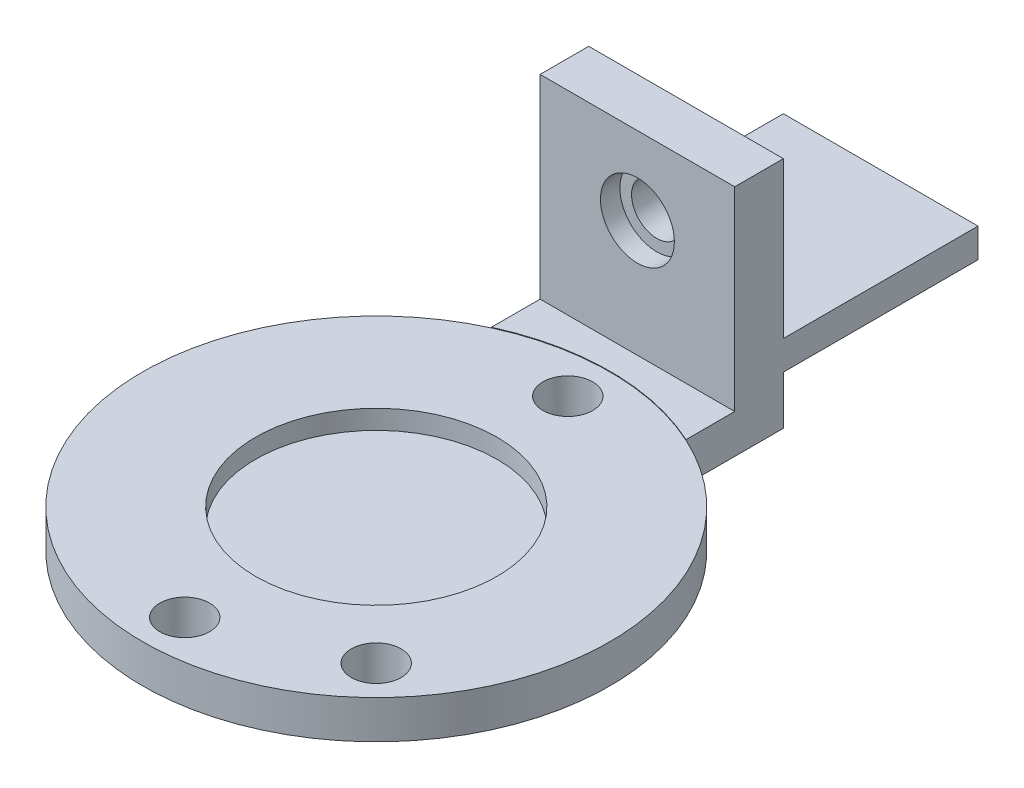
ISO-10303-21;
HEADER;
FILE_DESCRIPTION(('STEP AP214'),'2;1');
FILE_NAME('part.step','',(''),(''),'','','');
FILE_SCHEMA(('AUTOMOTIVE_DESIGN { 1 0 10303 214 1 1 1 1 }'));
ENDSEC;
DATA;
#1=APPLICATION_CONTEXT('core data for automotive mechanical design processes');
#2=APPLICATION_PROTOCOL_DEFINITION('international standard','automotive_design',2000,#1);
#3=PRODUCT_CONTEXT('',#1,'mechanical');
#4=PRODUCT('Part','Part','',(#3));
#5=PRODUCT_RELATED_PRODUCT_CATEGORY('part','',(#4));
#6=PRODUCT_DEFINITION_FORMATION('','',#4);
#7=PRODUCT_DEFINITION_CONTEXT('part definition',#1,'design');
#8=PRODUCT_DEFINITION('design','',#6,#7);
#9=PRODUCT_DEFINITION_SHAPE('','',#8);
#10=(LENGTH_UNIT() NAMED_UNIT(*) SI_UNIT(.MILLI.,.METRE.));
#11=(NAMED_UNIT(*) PLANE_ANGLE_UNIT() SI_UNIT($,.RADIAN.));
#12=(NAMED_UNIT(*) SI_UNIT($,.STERADIAN.) SOLID_ANGLE_UNIT());
#13=UNCERTAINTY_MEASURE_WITH_UNIT(LENGTH_MEASURE(1.E-05),#10,'distance_accuracy_value','');
#14=(GEOMETRIC_REPRESENTATION_CONTEXT(3) GLOBAL_UNCERTAINTY_ASSIGNED_CONTEXT((#13)) GLOBAL_UNIT_ASSIGNED_CONTEXT((#10,
#11,#12)) REPRESENTATION_CONTEXT('',''));
#15=CARTESIAN_POINT('',(0.,0.,0.));
#16=DIRECTION('',(0.,0.,1.));
#17=DIRECTION('',(1.,0.,0.));
#18=AXIS2_PLACEMENT_3D('',#15,#16,#17);
#19=CARTESIAN_POINT('',(0.,20.32,-32.8101280198992));
#20=DIRECTION('',(0.,0.,-1.));
#21=DIRECTION('',(-1.,0.,0.));
#22=AXIS2_PLACEMENT_3D('',#19,#20,#21);
#23=CYLINDRICAL_SURFACE('',#22,3.302);
#24=CARTESIAN_POINT('',(0.,20.32,-40.4301280198992));
#25=DIRECTION('',(0.,0.,-1.));
#26=DIRECTION('',(-1.,0.,0.));
#27=AXIS2_PLACEMENT_3D('',#24,#25,#26);
#28=CIRCLE('',#27,3.302);
#29=CARTESIAN_POINT('',(-3.302,20.32,-40.4301280198992));
#30=VERTEX_POINT('',#29);
#31=EDGE_CURVE('E346',#30,#30,#28,.T.);
#32=CARTESIAN_POINT('',(0.,20.32,-36.6201280198992));
#33=DIRECTION('',(0.,0.,1.));
#34=DIRECTION('',(1.,0.,0.));
#35=AXIS2_PLACEMENT_3D('',#32,#33,#34);
#36=CIRCLE('',#35,3.302);
#37=CARTESIAN_POINT('',(-3.302,20.32,-36.6201280198992));
#38=VERTEX_POINT('',#37);
#39=EDGE_CURVE('E39',#38,#38,#36,.F.);
#40=CARTESIAN_POINT('',(-3.302,20.32,-40.4301280198992));
#41=CARTESIAN_POINT('',(-3.302,20.32,-40.3904405198992));
#42=CARTESIAN_POINT('',(-3.302,20.32,-40.3507530198992));
#43=CARTESIAN_POINT('',(-3.302,20.32,-40.2713780198992));
#44=CARTESIAN_POINT('',(-3.302,20.32,-40.2316905198992));
#45=CARTESIAN_POINT('',(-3.302,20.32,-40.1523155198992));
#46=CARTESIAN_POINT('',(-3.302,20.32,-40.1126280198992));
#47=CARTESIAN_POINT('',(-3.302,20.32,-40.0332530198992));
#48=CARTESIAN_POINT('',(-3.302,20.32,-39.9935655198992));
#49=CARTESIAN_POINT('',(-3.302,20.32,-39.9141905198992));
#50=CARTESIAN_POINT('',(-3.302,20.32,-39.8745030198992));
#51=CARTESIAN_POINT('',(-3.302,20.32,-39.7951280198992));
#52=CARTESIAN_POINT('',(-3.302,20.32,-39.7554405198992));
#53=CARTESIAN_POINT('',(-3.302,20.32,-39.6760655198992));
#54=CARTESIAN_POINT('',(-3.302,20.32,-39.6363780198992));
#55=CARTESIAN_POINT('',(-3.302,20.32,-39.5570030198992));
#56=CARTESIAN_POINT('',(-3.302,20.32,-39.5173155198992));
#57=CARTESIAN_POINT('',(-3.302,20.32,-39.4379405198992));
#58=CARTESIAN_POINT('',(-3.302,20.32,-39.3982530198992));
#59=CARTESIAN_POINT('',(-3.302,20.32,-39.3188780198992));
#60=CARTESIAN_POINT('',(-3.302,20.32,-39.2791905198992));
#61=CARTESIAN_POINT('',(-3.302,20.32,-39.1998155198992));
#62=CARTESIAN_POINT('',(-3.302,20.32,-39.1601280198992));
#63=CARTESIAN_POINT('',(-3.302,20.32,-39.0807530198992));
#64=CARTESIAN_POINT('',(-3.302,20.32,-39.0410655198992));
#65=CARTESIAN_POINT('',(-3.302,20.32,-38.9616905198992));
#66=CARTESIAN_POINT('',(-3.302,20.32,-38.9220030198992));
#67=CARTESIAN_POINT('',(-3.302,20.32,-38.8426280198992));
#68=CARTESIAN_POINT('',(-3.302,20.32,-38.8029405198992));
#69=CARTESIAN_POINT('',(-3.302,20.32,-38.7235655198992));
#70=CARTESIAN_POINT('',(-3.302,20.32,-38.6838780198992));
#71=CARTESIAN_POINT('',(-3.302,20.32,-38.6045030198992));
#72=CARTESIAN_POINT('',(-3.302,20.32,-38.5648155198992));
#73=CARTESIAN_POINT('',(-3.302,20.32,-38.4854405198992));
#74=CARTESIAN_POINT('',(-3.302,20.32,-38.4457530198992));
#75=CARTESIAN_POINT('',(-3.302,20.32,-38.3663780198992));
#76=CARTESIAN_POINT('',(-3.302,20.32,-38.3266905198992));
#77=CARTESIAN_POINT('',(-3.302,20.32,-38.2473155198992));
#78=CARTESIAN_POINT('',(-3.302,20.32,-38.2076280198992));
#79=CARTESIAN_POINT('',(-3.302,20.32,-38.1282530198992));
#80=CARTESIAN_POINT('',(-3.302,20.32,-38.0885655198992));
#81=CARTESIAN_POINT('',(-3.302,20.32,-38.0091905198992));
#82=CARTESIAN_POINT('',(-3.302,20.32,-37.9695030198992));
#83=CARTESIAN_POINT('',(-3.302,20.32,-37.8901280198992));
#84=CARTESIAN_POINT('',(-3.302,20.32,-37.8504405198992));
#85=CARTESIAN_POINT('',(-3.302,20.32,-37.7710655198992));
#86=CARTESIAN_POINT('',(-3.302,20.32,-37.7313780198992));
#87=CARTESIAN_POINT('',(-3.302,20.32,-37.6520030198992));
#88=CARTESIAN_POINT('',(-3.302,20.32,-37.6123155198992));
#89=CARTESIAN_POINT('',(-3.302,20.32,-37.5329405198992));
#90=CARTESIAN_POINT('',(-3.302,20.32,-37.4932530198992));
#91=CARTESIAN_POINT('',(-3.302,20.32,-37.4138780198992));
#92=CARTESIAN_POINT('',(-3.302,20.32,-37.3741905198992));
#93=CARTESIAN_POINT('',(-3.302,20.32,-37.2948155198992));
#94=CARTESIAN_POINT('',(-3.302,20.32,-37.2551280198992));
#95=CARTESIAN_POINT('',(-3.302,20.32,-37.1757530198992));
#96=CARTESIAN_POINT('',(-3.302,20.32,-37.1360655198992));
#97=CARTESIAN_POINT('',(-3.302,20.32,-37.0566905198992));
#98=CARTESIAN_POINT('',(-3.302,20.32,-37.0170030198992));
#99=CARTESIAN_POINT('',(-3.302,20.32,-36.9376280198992));
#100=CARTESIAN_POINT('',(-3.302,20.32,-36.8979405198992));
#101=CARTESIAN_POINT('',(-3.302,20.32,-36.8185655198992));
#102=CARTESIAN_POINT('',(-3.302,20.32,-36.7788780198992));
#103=CARTESIAN_POINT('',(-3.302,20.32,-36.6995030198992));
#104=CARTESIAN_POINT('',(-3.302,20.32,-36.6598155198992));
#105=CARTESIAN_POINT('',(-3.302,20.32,-36.6201280198992));
#106=B_SPLINE_CURVE_WITH_KNOTS('',3,(#40,#41,#42,#43,#44,#45,#46,#47,#48,#49,#50,#51,#52,#53,
#54,#55,#56,#57,#58,#59,#60,#61,#62,#63,#64,#65,#66,#67,#68,#69,#70,#71,#72,#73,#74,#75,#76,#77,
#78,#79,#80,#81,#82,#83,#84,#85,#86,#87,#88,#89,#90,#91,#92,#93,#94,#95,#96,#97,#98,#99,#100,
#101,#102,#103,#104,#105),.UNSPECIFIED.,.F.,.F.,(4,2,2,2,2,2,2,2,2,2,2,2,2,2,2,2,2,2,2,2,2,2,2,
2,2,2,2,2,2,2,2,2,4),(0.,0.119062499999996,0.238124999999999,0.357187499999995,
0.476249999999998,0.595312499999993,0.714374999999996,0.833437499999992,0.952499999999995,
1.07156249999999,1.19062499999999,1.30968749999999,1.42874999999999,1.54781249999999,
1.66687499999999,1.78593749999999,1.90499999999999,2.02406249999999,2.14312499999999,
2.26218749999999,2.38124999999999,2.50031249999999,2.61937499999999,2.73843749999999,
2.85749999999998,2.97656249999999,3.09562499999998,3.21468749999999,3.33374999999998,
3.45281249999999,3.57187499999998,3.69093749999998,3.80999999999998),.UNSPECIFIED.);
#107=EDGE_CURVE('BSEAM35',#30,#38,#106,.T.);
#108=ORIENTED_EDGE('',*,*,#31,.T.);
#109=ORIENTED_EDGE('',*,*,#39,.F.);
#110=ORIENTED_EDGE('',*,*,#107,.T.);
#111=ORIENTED_EDGE('',*,*,#107,.F.);
#112=EDGE_LOOP('',(#108,#110,#109,#111));
#113=FACE_BOUND('',#112,.T.);
#114=ADVANCED_FACE('F35',(#113),#23,.F.);
#115=CARTESIAN_POINT('',(0.,5.08,-40.4301280198992));
#116=DIRECTION('',(0.,0.,-1.));
#117=DIRECTION('',(-1.,0.,0.));
#118=AXIS2_PLACEMENT_3D('',#115,#116,#117);
#119=PLANE('',#118);
#120=DIRECTION('',(-1.,0.,0.));
#121=VECTOR('',#120,1.);
#122=CARTESIAN_POINT('',(-12.7,6.35,-40.4301280198992));
#123=LINE('',#122,#121);
#124=CARTESIAN_POINT('',(12.7,6.35,-40.4301280198992));
#125=VERTEX_POINT('',#124);
#126=CARTESIAN_POINT('',(-12.7,6.35,-40.4301280198992));
#127=VERTEX_POINT('',#126);
#128=EDGE_CURVE('E52',#125,#127,#123,.T.);
#129=ORIENTED_EDGE('',*,*,#128,.F.);
#130=DIRECTION('',(0.,-1.,0.));
#131=VECTOR('',#130,1.);
#132=CARTESIAN_POINT('',(12.7,5.08,-40.4301280198992));
#133=LINE('',#132,#131);
#134=CARTESIAN_POINT('',(12.7,0.,-40.4301280198992));
#135=VERTEX_POINT('',#134);
#136=EDGE_CURVE('E189',#125,#135,#133,.T.);
#137=ORIENTED_EDGE('',*,*,#136,.T.);
#138=DIRECTION('',(1.,0.,0.));
#139=VECTOR('',#138,1.);
#140=CARTESIAN_POINT('',(0.,0.,-40.4301280198992));
#141=LINE('',#140,#139);
#142=CARTESIAN_POINT('',(-12.7,0.,-40.4301280198992));
#143=VERTEX_POINT('',#142);
#144=EDGE_CURVE('E173',#143,#135,#141,.T.);
#145=ORIENTED_EDGE('',*,*,#144,.F.);
#146=DIRECTION('',(0.,-1.,0.));
#147=VECTOR('',#146,1.);
#148=CARTESIAN_POINT('',(-12.7,5.08,-40.4301280198992));
#149=LINE('',#148,#147);
#150=EDGE_CURVE('E57',#127,#143,#149,.T.);
#151=ORIENTED_EDGE('',*,*,#150,.F.);
#152=EDGE_LOOP('',(#129,#137,#145,#151));
#153=FACE_BOUND('',#152,.T.);
#154=ADVANCED_FACE('F259',(#153),#119,.T.);
#155=CARTESIAN_POINT('',(0.,5.08,0.));
#156=DIRECTION('',(0.,-1.,0.));
#157=DIRECTION('',(0.,0.,-1.));
#158=AXIS2_PLACEMENT_3D('',#155,#156,#157);
#159=PLANE('',#158);
#160=DIRECTION('',(1.,0.,0.));
#161=VECTOR('',#160,1.);
#162=CARTESIAN_POINT('',(-12.7,5.08,-34.0801280198992));
#163=LINE('',#162,#161);
#164=CARTESIAN_POINT('',(-12.7,5.08,-34.0801280198992));
#165=VERTEX_POINT('',#164);
#166=CARTESIAN_POINT('',(12.7,5.08,-34.0801280198992));
#167=VERTEX_POINT('',#166);
#168=EDGE_CURVE('E144',#165,#167,#163,.T.);
#169=ORIENTED_EDGE('',*,*,#168,.F.);
#170=DIRECTION('',(0.,0.,-1.));
#171=VECTOR('',#170,1.);
#172=CARTESIAN_POINT('',(-12.7,5.08,0.));
#173=LINE('',#172,#171);
#174=CARTESIAN_POINT('',(-12.7,5.08,-27.7301280198992));
#175=VERTEX_POINT('',#174);
#176=EDGE_CURVE('E175',#175,#165,#173,.T.);
#177=ORIENTED_EDGE('',*,*,#176,.F.);
#178=CARTESIAN_POINT('',(0.,5.08,0.));
#179=DIRECTION('',(0.,-1.,0.));
#180=DIRECTION('',(0.,0.,-1.));
#181=AXIS2_PLACEMENT_3D('',#178,#179,#180);
#182=CIRCLE('',#181,30.5);
#183=CARTESIAN_POINT('',(12.7,5.08,-27.7301280198992));
#184=VERTEX_POINT('',#183);
#185=EDGE_CURVE('E172',#175,#184,#182,.T.);
#186=ORIENTED_EDGE('',*,*,#185,.T.);
#187=DIRECTION('',(0.,0.,-1.));
#188=VECTOR('',#187,1.);
#189=CARTESIAN_POINT('',(12.7,5.08,0.));
#190=LINE('',#189,#188);
#191=EDGE_CURVE('E170',#184,#167,#190,.T.);
#192=ORIENTED_EDGE('',*,*,#191,.T.);
#193=EDGE_LOOP('',(#169,#177,#186,#192));
#194=FACE_BOUND('',#193,.T.);
#195=ADVANCED_FACE('F246',(#194),#159,.F.);
#196=CARTESIAN_POINT('',(0.,5.,0.));
#197=DIRECTION('',(0.,-1.,0.));
#198=DIRECTION('',(0.,0.,-1.));
#199=AXIS2_PLACEMENT_3D('',#196,#197,#198);
#200=CYLINDRICAL_SURFACE('',#199,30.5);
#201=DIRECTION('',(0.,-1.,0.));
#202=VECTOR('',#201,1.);
#203=CARTESIAN_POINT('',(12.7,5.08,-27.7301280198992));
#204=LINE('',#203,#202);
#205=CARTESIAN_POINT('',(12.7,5.,-27.7301280198992));
#206=VERTEX_POINT('',#205);
#207=CARTESIAN_POINT('',(12.7,0.,-27.7301280198992));
#208=VERTEX_POINT('',#207);
#209=EDGE_CURVE('E178',#206,#208,#204,.T.);
#210=ORIENTED_EDGE('',*,*,#209,.F.);
#211=CARTESIAN_POINT('',(0.,5.,0.));
#212=DIRECTION('',(0.,1.,0.));
#213=DIRECTION('',(0.,0.,1.));
#214=AXIS2_PLACEMENT_3D('',#211,#212,#213);
#215=CIRCLE('',#214,30.5);
#216=CARTESIAN_POINT('',(-12.7,5.,-27.7301280198992));
#217=VERTEX_POINT('',#216);
#218=EDGE_CURVE('E226',#217,#206,#215,.T.);
#219=ORIENTED_EDGE('',*,*,#218,.F.);
#220=DIRECTION('',(0.,-1.,0.));
#221=VECTOR('',#220,1.);
#222=CARTESIAN_POINT('',(-12.7,5.08,-27.7301280198992));
#223=LINE('',#222,#221);
#224=CARTESIAN_POINT('',(-12.7,0.,-27.7301280198992));
#225=VERTEX_POINT('',#224);
#226=EDGE_CURVE('E194',#217,#225,#223,.T.);
#227=ORIENTED_EDGE('',*,*,#226,.T.);
#228=CARTESIAN_POINT('',(0.,0.,0.));
#229=DIRECTION('',(0.,1.,0.));
#230=DIRECTION('',(0.,0.,1.));
#231=AXIS2_PLACEMENT_3D('',#228,#229,#230);
#232=CIRCLE('',#231,30.5);
#233=EDGE_CURVE('E222',#225,#208,#232,.T.);
#234=ORIENTED_EDGE('',*,*,#233,.T.);
#235=EDGE_LOOP('',(#210,#219,#227,#234));
#236=FACE_BOUND('',#235,.T.);
#237=ADVANCED_FACE('F37',(#236),#200,.T.);
#238=CARTESIAN_POINT('',(0.,5.,0.));
#239=DIRECTION('',(0.,1.,0.));
#240=DIRECTION('',(0.,0.,1.));
#241=AXIS2_PLACEMENT_3D('',#238,#239,#240);
#242=PLANE('',#241);
#243=CARTESIAN_POINT('',(17.6744764826842,5.,17.680862));
#244=DIRECTION('',(0.,1.,0.));
#245=DIRECTION('',(0.,0.,1.));
#246=AXIS2_PLACEMENT_3D('',#243,#244,#245);
#247=CIRCLE('',#246,3.25);
#248=CARTESIAN_POINT('',(17.6744764826842,5.,20.930862));
#249=VERTEX_POINT('',#248);
#250=EDGE_CURVE('E200',#249,#249,#247,.T.);
#251=ORIENTED_EDGE('',*,*,#250,.F.);
#252=EDGE_LOOP('',(#251));
#253=FACE_BOUND('',#252,.T.);
#254=CARTESIAN_POINT('',(0.,5.,25.));
#255=DIRECTION('',(0.,1.,0.));
#256=DIRECTION('',(0.,0.,1.));
#257=AXIS2_PLACEMENT_3D('',#254,#255,#256);
#258=CIRCLE('',#257,3.25);
#259=CARTESIAN_POINT('',(0.,5.,28.25));
#260=VERTEX_POINT('',#259);
#261=EDGE_CURVE('E206',#260,#260,#258,.T.);
#262=ORIENTED_EDGE('',*,*,#261,.F.);
#263=EDGE_LOOP('',(#262));
#264=FACE_BOUND('',#263,.T.);
#265=CARTESIAN_POINT('',(0.,5.,-25.));
#266=DIRECTION('',(0.,1.,0.));
#267=DIRECTION('',(0.,0.,1.));
#268=AXIS2_PLACEMENT_3D('',#265,#266,#267);
#269=CIRCLE('',#268,3.25);
#270=CARTESIAN_POINT('',(0.,5.,-21.75));
#271=VERTEX_POINT('',#270);
#272=EDGE_CURVE('E212',#271,#271,#269,.T.);
#273=ORIENTED_EDGE('',*,*,#272,.F.);
#274=EDGE_LOOP('',(#273));
#275=FACE_BOUND('',#274,.T.);
#276=CARTESIAN_POINT('',(0.,5.,0.));
#277=DIRECTION('',(0.,1.,0.));
#278=DIRECTION('',(0.,0.,1.));
#279=AXIS2_PLACEMENT_3D('',#276,#277,#278);
#280=CIRCLE('',#279,15.75);
#281=CARTESIAN_POINT('',(0.,5.,15.75));
#282=VERTEX_POINT('',#281);
#283=EDGE_CURVE('E217',#282,#282,#280,.T.);
#284=ORIENTED_EDGE('',*,*,#283,.F.);
#285=EDGE_LOOP('',(#284));
#286=FACE_BOUND('',#285,.T.);
#287=EDGE_CURVE('E44',#206,#217,#215,.T.);
#288=ORIENTED_EDGE('',*,*,#287,.T.);
#289=ORIENTED_EDGE('',*,*,#218,.T.);
#290=EDGE_LOOP('',(#288,#289));
#291=FACE_BOUND('',#290,.T.);
#292=ADVANCED_FACE('F233',(#253,#264,#275,#286,#291),#242,.T.);
#293=CARTESIAN_POINT('',(0.,0.,0.));
#294=DIRECTION('',(0.,1.,0.));
#295=DIRECTION('',(0.,0.,1.));
#296=AXIS2_PLACEMENT_3D('',#293,#294,#295);
#297=PLANE('',#296);
#298=CARTESIAN_POINT('',(17.6744764826842,0.,17.680862));
#299=DIRECTION('',(0.,-1.,0.));
#300=DIRECTION('',(0.,0.,-1.));
#301=AXIS2_PLACEMENT_3D('',#298,#299,#300);
#302=CIRCLE('',#301,3.25);
#303=CARTESIAN_POINT('',(17.6744764826842,0.,14.430862));
#304=VERTEX_POINT('',#303);
#305=EDGE_CURVE('E188',#304,#304,#302,.T.);
#306=ORIENTED_EDGE('',*,*,#305,.F.);
#307=EDGE_LOOP('',(#306));
#308=FACE_BOUND('',#307,.T.);
#309=CARTESIAN_POINT('',(0.,0.,25.));
#310=DIRECTION('',(0.,-1.,0.));
#311=DIRECTION('',(0.,0.,-1.));
#312=AXIS2_PLACEMENT_3D('',#309,#310,#311);
#313=CIRCLE('',#312,3.25);
#314=CARTESIAN_POINT('',(0.,0.,21.75));
#315=VERTEX_POINT('',#314);
#316=EDGE_CURVE('E203',#315,#315,#313,.T.);
#317=ORIENTED_EDGE('',*,*,#316,.F.);
#318=EDGE_LOOP('',(#317));
#319=FACE_BOUND('',#318,.T.);
#320=CARTESIAN_POINT('',(0.,0.,-25.));
#321=DIRECTION('',(0.,-1.,0.));
#322=DIRECTION('',(0.,0.,-1.));
#323=AXIS2_PLACEMENT_3D('',#320,#321,#322);
#324=CIRCLE('',#323,3.25);
#325=CARTESIAN_POINT('',(0.,0.,-28.25));
#326=VERTEX_POINT('',#325);
#327=EDGE_CURVE('E209',#326,#326,#324,.T.);
#328=ORIENTED_EDGE('',*,*,#327,.F.);
#329=EDGE_LOOP('',(#328));
#330=FACE_BOUND('',#329,.T.);
#331=CARTESIAN_POINT('',(0.,0.,0.));
#332=DIRECTION('',(0.,-1.,0.));
#333=DIRECTION('',(0.,0.,-1.));
#334=AXIS2_PLACEMENT_3D('',#331,#332,#333);
#335=CIRCLE('',#334,15.75);
#336=CARTESIAN_POINT('',(0.,0.,-15.75));
#337=VERTEX_POINT('',#336);
#338=EDGE_CURVE('E11',#337,#337,#335,.T.);
#339=ORIENTED_EDGE('',*,*,#338,.F.);
#340=EDGE_LOOP('',(#339));
#341=FACE_BOUND('',#340,.T.);
#342=ORIENTED_EDGE('',*,*,#233,.F.);
#343=DIRECTION('',(0.,0.,-1.));
#344=VECTOR('',#343,1.);
#345=CARTESIAN_POINT('',(-12.7,0.,0.));
#346=LINE('',#345,#344);
#347=EDGE_CURVE('E181',#225,#143,#346,.T.);
#348=ORIENTED_EDGE('',*,*,#347,.T.);
#349=ORIENTED_EDGE('',*,*,#144,.T.);
#350=DIRECTION('',(0.,0.,-1.));
#351=VECTOR('',#350,1.);
#352=CARTESIAN_POINT('',(12.7,0.,0.));
#353=LINE('',#352,#351);
#354=EDGE_CURVE('E169',#208,#135,#353,.T.);
#355=ORIENTED_EDGE('',*,*,#354,.F.);
#356=EDGE_LOOP('',(#342,#348,#349,#355));
#357=FACE_BOUND('',#356,.T.);
#358=ADVANCED_FACE('F256',(#308,#319,#330,#341,#357),#297,.F.);
#359=CARTESIAN_POINT('',(0.,2.5,0.));
#360=DIRECTION('',(0.,1.,0.));
#361=DIRECTION('',(0.,0.,1.));
#362=AXIS2_PLACEMENT_3D('',#359,#360,#361);
#363=CYLINDRICAL_SURFACE('',#362,15.75);
#364=CARTESIAN_POINT('',(0.,2.5,0.));
#365=DIRECTION('',(0.,1.,0.));
#366=DIRECTION('',(0.,0.,1.));
#367=AXIS2_PLACEMENT_3D('',#364,#365,#366);
#368=CIRCLE('',#367,15.75);
#369=CARTESIAN_POINT('',(0.,2.5,15.75));
#370=VERTEX_POINT('',#369);
#371=EDGE_CURVE('E219',#370,#370,#368,.T.);
#372=ORIENTED_EDGE('',*,*,#371,.F.);
#373=EDGE_LOOP('',(#372));
#374=FACE_BOUND('',#373,.T.);
#375=ORIENTED_EDGE('',*,*,#283,.T.);
#376=EDGE_LOOP('',(#375));
#377=FACE_BOUND('',#376,.T.);
#378=ADVANCED_FACE('F322',(#374,#377),#363,.F.);
#379=CARTESIAN_POINT('',(0.,2.5,0.));
#380=DIRECTION('',(0.,1.,0.));
#381=DIRECTION('',(0.,0.,1.));
#382=AXIS2_PLACEMENT_3D('',#379,#380,#381);
#383=PLANE('',#382);
#384=ORIENTED_EDGE('',*,*,#371,.T.);
#385=EDGE_LOOP('',(#384));
#386=FACE_BOUND('',#385,.T.);
#387=ADVANCED_FACE('F318',(#386),#383,.T.);
#388=CARTESIAN_POINT('',(0.,-2.5,0.));
#389=DIRECTION('',(0.,1.,0.));
#390=DIRECTION('',(0.,0.,1.));
#391=AXIS2_PLACEMENT_3D('',#388,#389,#390);
#392=CYLINDRICAL_SURFACE('',#391,15.75);
#393=CARTESIAN_POINT('',(0.,-2.5,0.));
#394=DIRECTION('',(0.,-1.,0.));
#395=DIRECTION('',(0.,0.,-1.));
#396=AXIS2_PLACEMENT_3D('',#393,#394,#395);
#397=CIRCLE('',#396,15.75);
#398=CARTESIAN_POINT('',(0.,-2.5,-15.75));
#399=VERTEX_POINT('',#398);
#400=EDGE_CURVE('E215',#399,#399,#397,.T.);
#401=ORIENTED_EDGE('',*,*,#400,.F.);
#402=EDGE_LOOP('',(#401));
#403=FACE_BOUND('',#402,.T.);
#404=ORIENTED_EDGE('',*,*,#338,.T.);
#405=EDGE_LOOP('',(#404));
#406=FACE_BOUND('',#405,.T.);
#407=ADVANCED_FACE('F314',(#403,#406),#392,.T.);
#408=CARTESIAN_POINT('',(0.,-2.5,0.));
#409=DIRECTION('',(0.,-1.,0.));
#410=DIRECTION('',(0.,0.,-1.));
#411=AXIS2_PLACEMENT_3D('',#408,#409,#410);
#412=PLANE('',#411);
#413=ORIENTED_EDGE('',*,*,#400,.T.);
#414=EDGE_LOOP('',(#413));
#415=FACE_BOUND('',#414,.T.);
#416=ADVANCED_FACE('F310',(#415),#412,.T.);
#417=CARTESIAN_POINT('',(0.,5.08,-25.));
#418=DIRECTION('',(0.,-1.,0.));
#419=DIRECTION('',(0.,0.,-1.));
#420=AXIS2_PLACEMENT_3D('',#417,#418,#419);
#421=CYLINDRICAL_SURFACE('',#420,3.25);
#422=ORIENTED_EDGE('',*,*,#272,.T.);
#423=EDGE_LOOP('',(#422));
#424=FACE_BOUND('',#423,.T.);
#425=ORIENTED_EDGE('',*,*,#327,.T.);
#426=EDGE_LOOP('',(#425));
#427=FACE_BOUND('',#426,.T.);
#428=ADVANCED_FACE('F306',(#424,#427),#421,.F.);
#429=CARTESIAN_POINT('',(0.,5.08,25.));
#430=DIRECTION('',(0.,-1.,0.));
#431=DIRECTION('',(0.,0.,-1.));
#432=AXIS2_PLACEMENT_3D('',#429,#430,#431);
#433=CYLINDRICAL_SURFACE('',#432,3.25);
#434=ORIENTED_EDGE('',*,*,#261,.T.);
#435=EDGE_LOOP('',(#434));
#436=FACE_BOUND('',#435,.T.);
#437=ORIENTED_EDGE('',*,*,#316,.T.);
#438=EDGE_LOOP('',(#437));
#439=FACE_BOUND('',#438,.T.);
#440=ADVANCED_FACE('F302',(#436,#439),#433,.F.);
#441=CARTESIAN_POINT('',(17.6744764826842,5.08,17.680862));
#442=DIRECTION('',(0.,-1.,0.));
#443=DIRECTION('',(0.,0.,-1.));
#444=AXIS2_PLACEMENT_3D('',#441,#442,#443);
#445=CYLINDRICAL_SURFACE('',#444,3.25);
#446=ORIENTED_EDGE('',*,*,#250,.T.);
#447=EDGE_LOOP('',(#446));
#448=FACE_BOUND('',#447,.T.);
#449=ORIENTED_EDGE('',*,*,#305,.T.);
#450=EDGE_LOOP('',(#449));
#451=FACE_BOUND('',#450,.T.);
#452=ADVANCED_FACE('F299',(#448,#451),#445,.F.);
#453=CARTESIAN_POINT('',(12.7,5.08,0.));
#454=DIRECTION('',(-1.,0.,0.));
#455=DIRECTION('',(0.,0.,1.));
#456=AXIS2_PLACEMENT_3D('',#453,#454,#455);
#457=PLANE('',#456);
#458=ORIENTED_EDGE('',*,*,#354,.T.);
#459=ORIENTED_EDGE('',*,*,#136,.F.);
#460=DIRECTION('',(0.,0.,1.));
#461=VECTOR('',#460,1.);
#462=CARTESIAN_POINT('',(12.7,6.35,-65.8301280198992));
#463=LINE('',#462,#461);
#464=CARTESIAN_POINT('',(12.7,6.35,-65.8301280198992));
#465=VERTEX_POINT('',#464);
#466=EDGE_CURVE('E149',#465,#125,#463,.T.);
#467=ORIENTED_EDGE('',*,*,#466,.F.);
#468=DIRECTION('',(0.,-1.,0.));
#469=VECTOR('',#468,1.);
#470=CARTESIAN_POINT('',(12.7,6.35,-65.8301280198992));
#471=LINE('',#470,#469);
#472=CARTESIAN_POINT('',(12.7,10.16,-65.8301280198992));
#473=VERTEX_POINT('',#472);
#474=EDGE_CURVE('E128',#473,#465,#471,.T.);
#475=ORIENTED_EDGE('',*,*,#474,.F.);
#476=DIRECTION('',(0.,0.,1.));
#477=VECTOR('',#476,1.);
#478=CARTESIAN_POINT('',(12.7,10.16,-65.8301280198992));
#479=LINE('',#478,#477);
#480=CARTESIAN_POINT('',(12.7,10.16,-40.4301280198992));
#481=VERTEX_POINT('',#480);
#482=EDGE_CURVE('E125',#473,#481,#479,.T.);
#483=ORIENTED_EDGE('',*,*,#482,.T.);
#484=CARTESIAN_POINT('',(12.7,30.48,-40.4301280198992));
#485=VERTEX_POINT('',#484);
#486=EDGE_CURVE('E186',#485,#481,#133,.T.);
#487=ORIENTED_EDGE('',*,*,#486,.F.);
#488=DIRECTION('',(0.,0.,-1.));
#489=VECTOR('',#488,1.);
#490=CARTESIAN_POINT('',(12.7,30.48,-40.4301280198992));
#491=LINE('',#490,#489);
#492=CARTESIAN_POINT('',(12.7,30.48,-34.0801280198992));
#493=VERTEX_POINT('',#492);
#494=EDGE_CURVE('E157',#493,#485,#491,.T.);
#495=ORIENTED_EDGE('',*,*,#494,.F.);
#496=DIRECTION('',(0.,-1.,0.));
#497=VECTOR('',#496,1.);
#498=CARTESIAN_POINT('',(12.7,30.48,-34.0801280198992));
#499=LINE('',#498,#497);
#500=EDGE_CURVE('E162',#493,#167,#499,.T.);
#501=ORIENTED_EDGE('',*,*,#500,.T.);
#502=ORIENTED_EDGE('',*,*,#191,.F.);
#503=EDGE_CURVE('E195',#184,#206,#204,.T.);
#504=ORIENTED_EDGE('',*,*,#503,.T.);
#505=ORIENTED_EDGE('',*,*,#209,.T.);
#506=EDGE_LOOP('',(#458,#459,#467,#475,#483,#487,#495,#501,#502,#504,#505));
#507=FACE_BOUND('',#506,.T.);
#508=ADVANCED_FACE('F241',(#507),#457,.F.);
#509=ORIENTED_EDGE('',*,*,#31,.F.);
#510=EDGE_LOOP('',(#509));
#511=FACE_BOUND('',#510,.T.);
#512=DIRECTION('',(1.,0.,0.));
#513=VECTOR('',#512,1.);
#514=CARTESIAN_POINT('',(-12.7,10.16,-40.4301280198992));
#515=LINE('',#514,#513);
#516=CARTESIAN_POINT('',(-12.7,10.16,-40.4301280198992));
#517=VERTEX_POINT('',#516);
#518=EDGE_CURVE('E344',#517,#481,#515,.T.);
#519=ORIENTED_EDGE('',*,*,#518,.F.);
#520=CARTESIAN_POINT('',(-12.7,30.48,-40.4301280198992));
#521=VERTEX_POINT('',#520);
#522=EDGE_CURVE('E143',#521,#517,#149,.T.);
#523=ORIENTED_EDGE('',*,*,#522,.F.);
#524=DIRECTION('',(-1.,0.,0.));
#525=VECTOR('',#524,1.);
#526=CARTESIAN_POINT('',(-12.7,30.48,-40.4301280198992));
#527=LINE('',#526,#525);
#528=EDGE_CURVE('E160',#485,#521,#527,.T.);
#529=ORIENTED_EDGE('',*,*,#528,.F.);
#530=ORIENTED_EDGE('',*,*,#486,.T.);
#531=EDGE_LOOP('',(#519,#523,#529,#530));
#532=FACE_BOUND('',#531,.T.);
#533=ADVANCED_FACE('F268',(#511,#532),#119,.T.);
#534=CARTESIAN_POINT('',(-12.7,5.08,0.));
#535=DIRECTION('',(-1.,0.,0.));
#536=DIRECTION('',(0.,0.,1.));
#537=AXIS2_PLACEMENT_3D('',#534,#535,#536);
#538=PLANE('',#537);
#539=ORIENTED_EDGE('',*,*,#347,.F.);
#540=ORIENTED_EDGE('',*,*,#226,.F.);
#541=EDGE_CURVE('E191',#175,#217,#223,.T.);
#542=ORIENTED_EDGE('',*,*,#541,.F.);
#543=ORIENTED_EDGE('',*,*,#176,.T.);
#544=DIRECTION('',(0.,-1.,0.));
#545=VECTOR('',#544,1.);
#546=CARTESIAN_POINT('',(-12.7,30.48,-34.0801280198992));
#547=LINE('',#546,#545);
#548=CARTESIAN_POINT('',(-12.7,30.48,-34.0801280198992));
#549=VERTEX_POINT('',#548);
#550=EDGE_CURVE('E166',#549,#165,#547,.T.);
#551=ORIENTED_EDGE('',*,*,#550,.F.);
#552=DIRECTION('',(0.,0.,1.));
#553=VECTOR('',#552,1.);
#554=CARTESIAN_POINT('',(-12.7,30.48,-40.4301280198992));
#555=LINE('',#554,#553);
#556=EDGE_CURVE('E147',#521,#549,#555,.T.);
#557=ORIENTED_EDGE('',*,*,#556,.F.);
#558=ORIENTED_EDGE('',*,*,#522,.T.);
#559=DIRECTION('',(0.,0.,1.));
#560=VECTOR('',#559,1.);
#561=CARTESIAN_POINT('',(-12.7,10.16,-65.8301280198992));
#562=LINE('',#561,#560);
#563=CARTESIAN_POINT('',(-12.7,10.16,-65.8301280198992));
#564=VERTEX_POINT('',#563);
#565=EDGE_CURVE('E123',#564,#517,#562,.T.);
#566=ORIENTED_EDGE('',*,*,#565,.F.);
#567=DIRECTION('',(0.,1.,0.));
#568=VECTOR('',#567,1.);
#569=CARTESIAN_POINT('',(-12.7,6.35,-65.8301280198992));
#570=LINE('',#569,#568);
#571=CARTESIAN_POINT('',(-12.7,6.35,-65.8301280198992));
#572=VERTEX_POINT('',#571);
#573=EDGE_CURVE('E129',#572,#564,#570,.T.);
#574=ORIENTED_EDGE('',*,*,#573,.F.);
#575=DIRECTION('',(0.,0.,1.));
#576=VECTOR('',#575,1.);
#577=CARTESIAN_POINT('',(-12.7,6.35,-65.8301280198992));
#578=LINE('',#577,#576);
#579=EDGE_CURVE('E340',#572,#127,#578,.T.);
#580=ORIENTED_EDGE('',*,*,#579,.T.);
#581=ORIENTED_EDGE('',*,*,#150,.T.);
#582=EDGE_LOOP('',(#539,#540,#542,#543,#551,#557,#558,#566,#574,#580,#581));
#583=FACE_BOUND('',#582,.T.);
#584=ADVANCED_FACE('F141',(#583),#538,.T.);
#585=CARTESIAN_POINT('',(0.,5.08,0.));
#586=DIRECTION('',(0.,-1.,0.));
#587=DIRECTION('',(0.,0.,-1.));
#588=AXIS2_PLACEMENT_3D('',#585,#586,#587);
#589=CYLINDRICAL_SURFACE('',#588,30.5);
#590=ORIENTED_EDGE('',*,*,#287,.F.);
#591=ORIENTED_EDGE('',*,*,#503,.F.);
#592=ORIENTED_EDGE('',*,*,#185,.F.);
#593=ORIENTED_EDGE('',*,*,#541,.T.);
#594=EDGE_LOOP('',(#590,#591,#592,#593));
#595=FACE_BOUND('',#594,.T.);
#596=ADVANCED_FACE('F237',(#595),#589,.F.);
#597=CARTESIAN_POINT('',(-12.7,30.48,-34.0801280198992));
#598=DIRECTION('',(0.,0.,-1.));
#599=DIRECTION('',(-1.,0.,0.));
#600=AXIS2_PLACEMENT_3D('',#597,#598,#599);
#601=PLANE('',#600);
#602=CARTESIAN_POINT('',(0.,20.32,-34.0801280198992));
#603=DIRECTION('',(0.,0.,1.));
#604=DIRECTION('',(1.,0.,0.));
#605=AXIS2_PLACEMENT_3D('',#602,#603,#604);
#606=CIRCLE('',#605,4.826);
#607=CARTESIAN_POINT('',(4.826,20.32,-34.0801280198992));
#608=VERTEX_POINT('',#607);
#609=EDGE_CURVE('E350',#608,#608,#606,.T.);
#610=ORIENTED_EDGE('',*,*,#609,.F.);
#611=EDGE_LOOP('',(#610));
#612=FACE_BOUND('',#611,.T.);
#613=ORIENTED_EDGE('',*,*,#168,.T.);
#614=ORIENTED_EDGE('',*,*,#500,.F.);
#615=DIRECTION('',(1.,0.,0.));
#616=VECTOR('',#615,1.);
#617=CARTESIAN_POINT('',(-12.7,30.48,-34.0801280198992));
#618=LINE('',#617,#616);
#619=EDGE_CURVE('E155',#549,#493,#618,.T.);
#620=ORIENTED_EDGE('',*,*,#619,.F.);
#621=ORIENTED_EDGE('',*,*,#550,.T.);
#622=EDGE_LOOP('',(#613,#614,#620,#621));
#623=FACE_BOUND('',#622,.T.);
#624=ADVANCED_FACE('F249',(#612,#623),#601,.F.);
#625=CARTESIAN_POINT('',(0.,30.48,0.));
#626=DIRECTION('',(0.,1.,0.));
#627=DIRECTION('',(0.,0.,1.));
#628=AXIS2_PLACEMENT_3D('',#625,#626,#627);
#629=PLANE('',#628);
#630=ORIENTED_EDGE('',*,*,#556,.T.);
#631=ORIENTED_EDGE('',*,*,#619,.T.);
#632=ORIENTED_EDGE('',*,*,#494,.T.);
#633=ORIENTED_EDGE('',*,*,#528,.T.);
#634=EDGE_LOOP('',(#630,#631,#632,#633));
#635=FACE_BOUND('',#634,.T.);
#636=ADVANCED_FACE('F284',(#635),#629,.T.);
#637=CARTESIAN_POINT('',(-12.7,10.16,-65.8301280198992));
#638=DIRECTION('',(0.,-1.,0.));
#639=DIRECTION('',(1.,0.,0.));
#640=AXIS2_PLACEMENT_3D('',#637,#638,#639);
#641=PLANE('',#640);
#642=ORIENTED_EDGE('',*,*,#518,.T.);
#643=ORIENTED_EDGE('',*,*,#482,.F.);
#644=DIRECTION('',(1.,0.,0.));
#645=VECTOR('',#644,1.);
#646=CARTESIAN_POINT('',(-12.7,10.16,-65.8301280198992));
#647=LINE('',#646,#645);
#648=EDGE_CURVE('E118',#564,#473,#647,.T.);
#649=ORIENTED_EDGE('',*,*,#648,.F.);
#650=ORIENTED_EDGE('',*,*,#565,.T.);
#651=EDGE_LOOP('',(#642,#643,#649,#650));
#652=FACE_BOUND('',#651,.T.);
#653=ADVANCED_FACE('F121',(#652),#641,.F.);
#654=CARTESIAN_POINT('',(-12.7,6.35,-65.8301280198992));
#655=DIRECTION('',(0.,1.,0.));
#656=DIRECTION('',(-1.,0.,0.));
#657=AXIS2_PLACEMENT_3D('',#654,#655,#656);
#658=PLANE('',#657);
#659=ORIENTED_EDGE('',*,*,#128,.T.);
#660=ORIENTED_EDGE('',*,*,#579,.F.);
#661=DIRECTION('',(-1.,0.,0.));
#662=VECTOR('',#661,1.);
#663=CARTESIAN_POINT('',(-12.7,6.35,-65.8301280198992));
#664=LINE('',#663,#662);
#665=EDGE_CURVE('E134',#465,#572,#664,.T.);
#666=ORIENTED_EDGE('',*,*,#665,.F.);
#667=ORIENTED_EDGE('',*,*,#466,.T.);
#668=EDGE_LOOP('',(#659,#660,#666,#667));
#669=FACE_BOUND('',#668,.T.);
#670=ADVANCED_FACE('F278',(#669),#658,.F.);
#671=CARTESIAN_POINT('',(0.,0.,-65.8301280198992));
#672=DIRECTION('',(0.,0.,-1.));
#673=DIRECTION('',(-1.,0.,0.));
#674=AXIS2_PLACEMENT_3D('',#671,#672,#673);
#675=PLANE('',#674);
#676=ORIENTED_EDGE('',*,*,#573,.T.);
#677=ORIENTED_EDGE('',*,*,#648,.T.);
#678=ORIENTED_EDGE('',*,*,#474,.T.);
#679=ORIENTED_EDGE('',*,*,#665,.T.);
#680=EDGE_LOOP('',(#676,#677,#678,#679));
#681=FACE_BOUND('',#680,.T.);
#682=ADVANCED_FACE('F132',(#681),#675,.T.);
#683=CARTESIAN_POINT('',(0.,20.32,-36.6201280198992));
#684=DIRECTION('',(0.,0.,1.));
#685=DIRECTION('',(1.,0.,0.));
#686=AXIS2_PLACEMENT_3D('',#683,#684,#685);
#687=PLANE('',#686);
#688=CARTESIAN_POINT('',(0.,20.32,-36.6201280198992));
#689=DIRECTION('',(0.,0.,1.));
#690=DIRECTION('',(1.,0.,0.));
#691=AXIS2_PLACEMENT_3D('',#688,#689,#690);
#692=CIRCLE('',#691,4.826);
#693=CARTESIAN_POINT('',(4.826,20.32,-36.6201280198992));
#694=VERTEX_POINT('',#693);
#695=EDGE_CURVE('E353',#694,#694,#692,.T.);
#696=ORIENTED_EDGE('',*,*,#695,.T.);
#697=EDGE_LOOP('',(#696));
#698=FACE_BOUND('',#697,.T.);
#699=ORIENTED_EDGE('',*,*,#39,.T.);
#700=EDGE_LOOP('',(#699));
#701=FACE_BOUND('',#700,.T.);
#702=ADVANCED_FACE('F277',(#698,#701),#687,.T.);
#703=CARTESIAN_POINT('',(0.,20.32,-36.6201280198992));
#704=DIRECTION('',(0.,0.,1.));
#705=DIRECTION('',(1.,0.,0.));
#706=AXIS2_PLACEMENT_3D('',#703,#704,#705);
#707=CYLINDRICAL_SURFACE('',#706,4.826);
#708=ORIENTED_EDGE('',*,*,#695,.F.);
#709=EDGE_LOOP('',(#708));
#710=FACE_BOUND('',#709,.T.);
#711=ORIENTED_EDGE('',*,*,#609,.T.);
#712=EDGE_LOOP('',(#711));
#713=FACE_BOUND('',#712,.T.);
#714=ADVANCED_FACE('F273',(#710,#713),#707,.F.);
#715=CLOSED_SHELL('',(#114,#154,#195,#237,#292,#358,#378,#387,#407,#416,#428,#440,#452,#508,
#533,#584,#596,#624,#636,#653,#670,#682,#702,#714));
#716=MANIFOLD_SOLID_BREP('B2',#715);
#717=ADVANCED_BREP_SHAPE_REPRESENTATION('',(#18,#716),#14);
#718=SHAPE_DEFINITION_REPRESENTATION(#9,#717);
ENDSEC;
END-ISO-10303-21;
